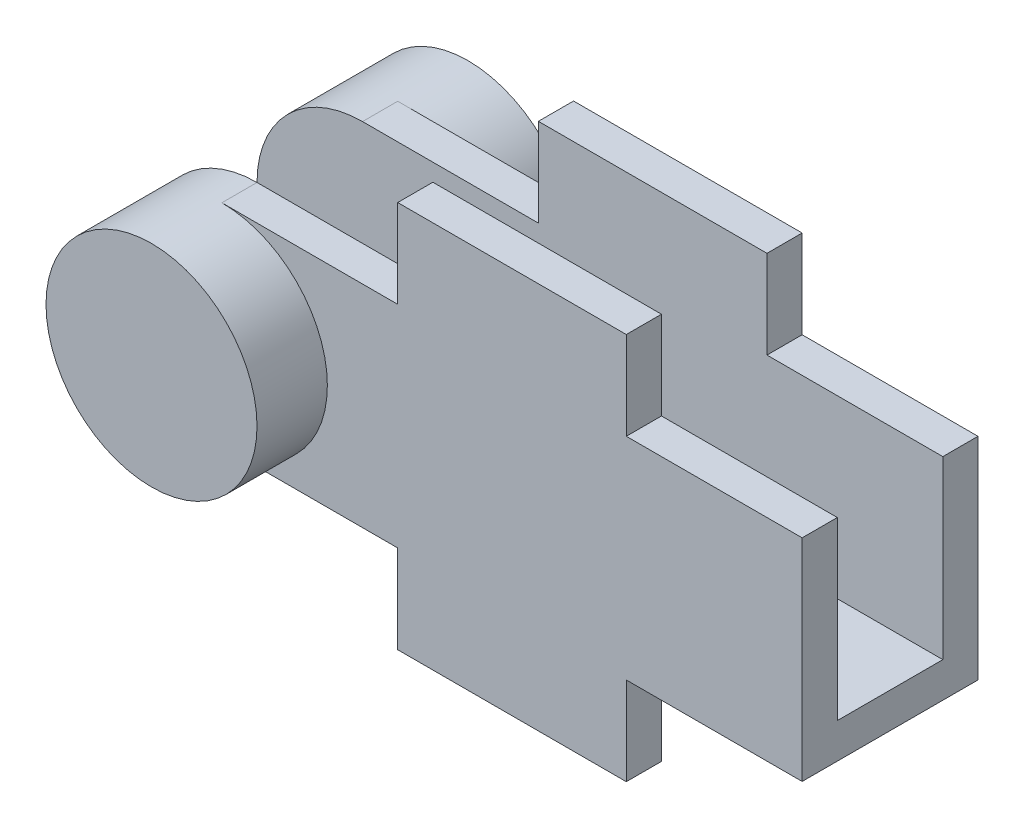
ISO-10303-21;
HEADER;
FILE_DESCRIPTION(('STEP AP214'),'2;1');
FILE_NAME('part.step','',(''),(''),'','','');
FILE_SCHEMA(('AUTOMOTIVE_DESIGN { 1 0 10303 214 1 1 1 1 }'));
ENDSEC;
DATA;
#1=APPLICATION_CONTEXT('core data for automotive mechanical design processes');
#2=APPLICATION_PROTOCOL_DEFINITION('international standard','automotive_design',2000,#1);
#3=PRODUCT_CONTEXT('',#1,'mechanical');
#4=PRODUCT('Part','Part','',(#3));
#5=PRODUCT_RELATED_PRODUCT_CATEGORY('part','',(#4));
#6=PRODUCT_DEFINITION_FORMATION('','',#4);
#7=PRODUCT_DEFINITION_CONTEXT('part definition',#1,'design');
#8=PRODUCT_DEFINITION('design','',#6,#7);
#9=PRODUCT_DEFINITION_SHAPE('','',#8);
#10=(LENGTH_UNIT() NAMED_UNIT(*) SI_UNIT(.MILLI.,.METRE.));
#11=(NAMED_UNIT(*) PLANE_ANGLE_UNIT() SI_UNIT($,.RADIAN.));
#12=(NAMED_UNIT(*) SI_UNIT($,.STERADIAN.) SOLID_ANGLE_UNIT());
#13=UNCERTAINTY_MEASURE_WITH_UNIT(LENGTH_MEASURE(1.E-05),#10,'distance_accuracy_value','');
#14=(GEOMETRIC_REPRESENTATION_CONTEXT(3) GLOBAL_UNCERTAINTY_ASSIGNED_CONTEXT((#13)) GLOBAL_UNIT_ASSIGNED_CONTEXT((#10,
#11,#12)) REPRESENTATION_CONTEXT('',''));
#15=CARTESIAN_POINT('',(0.,0.,0.));
#16=DIRECTION('',(0.,0.,1.));
#17=DIRECTION('',(1.,0.,0.));
#18=AXIS2_PLACEMENT_3D('',#15,#16,#17);
#19=CARTESIAN_POINT('',(-215.,-20.,10.));
#20=DIRECTION('',(-1.,0.,0.));
#21=DIRECTION('',(0.,-1.,0.));
#22=AXIS2_PLACEMENT_3D('',#19,#20,#21);
#23=PLANE('',#22);
#24=DIRECTION('',(0.,0.,-1.));
#25=VECTOR('',#24,1.);
#26=CARTESIAN_POINT('',(-215.,-20.,10.));
#27=LINE('',#26,#25);
#28=CARTESIAN_POINT('',(-215.,-20.,0.));
#29=VERTEX_POINT('',#28);
#30=CARTESIAN_POINT('',(-215.,-20.,-30.));
#31=VERTEX_POINT('',#30);
#32=EDGE_CURVE('E240',#29,#31,#27,.T.);
#33=ORIENTED_EDGE('',*,*,#32,.T.);
#34=DIRECTION('',(0.,-1.,0.));
#35=VECTOR('',#34,1.);
#36=CARTESIAN_POINT('',(-215.,-20.,-30.));
#37=LINE('',#36,#35);
#38=CARTESIAN_POINT('',(-215.,-30.,-30.));
#39=VERTEX_POINT('',#38);
#40=EDGE_CURVE('E71',#31,#39,#37,.T.);
#41=ORIENTED_EDGE('',*,*,#40,.T.);
#42=DIRECTION('',(0.,0.,-1.));
#43=VECTOR('',#42,1.);
#44=CARTESIAN_POINT('',(-215.,-30.,10.));
#45=LINE('',#44,#43);
#46=CARTESIAN_POINT('',(-215.,-30.,0.));
#47=VERTEX_POINT('',#46);
#48=EDGE_CURVE('E230',#47,#39,#45,.T.);
#49=ORIENTED_EDGE('',*,*,#48,.F.);
#50=DIRECTION('',(0.,-1.,0.));
#51=VECTOR('',#50,1.);
#52=CARTESIAN_POINT('',(-215.,0.,0.));
#53=LINE('',#52,#51);
#54=EDGE_CURVE('E385',#29,#47,#53,.T.);
#55=ORIENTED_EDGE('',*,*,#54,.F.);
#56=EDGE_LOOP('',(#33,#41,#49,#55));
#57=FACE_BOUND('',#56,.T.);
#58=ADVANCED_FACE('F46',(#57),#23,.T.);
#59=CARTESIAN_POINT('',(0.,-20.,0.));
#60=DIRECTION('',(0.,-1.,0.));
#61=DIRECTION('',(1.,0.,0.));
#62=AXIS2_PLACEMENT_3D('',#59,#60,#61);
#63=PLANE('',#62);
#64=DIRECTION('',(1.,0.,0.));
#65=VECTOR('',#64,1.);
#66=CARTESIAN_POINT('',(0.,-20.,-30.));
#67=LINE('',#66,#65);
#68=CARTESIAN_POINT('',(-50.,-20.,-30.));
#69=VERTEX_POINT('',#68);
#70=EDGE_CURVE('E50',#31,#69,#67,.T.);
#71=ORIENTED_EDGE('',*,*,#70,.F.);
#72=ORIENTED_EDGE('',*,*,#32,.F.);
#73=DIRECTION('',(1.,0.,0.));
#74=VECTOR('',#73,1.);
#75=CARTESIAN_POINT('',(0.,-20.,0.));
#76=LINE('',#75,#74);
#77=CARTESIAN_POINT('',(-50.,-20.,0.));
#78=VERTEX_POINT('',#77);
#79=EDGE_CURVE('E382',#29,#78,#76,.T.);
#80=ORIENTED_EDGE('',*,*,#79,.T.);
#81=DIRECTION('',(0.,0.,1.));
#82=VECTOR('',#81,1.);
#83=CARTESIAN_POINT('',(-50.,-20.,10.));
#84=LINE('',#83,#82);
#85=EDGE_CURVE('E245',#69,#78,#84,.T.);
#86=ORIENTED_EDGE('',*,*,#85,.F.);
#87=EDGE_LOOP('',(#71,#72,#80,#86));
#88=FACE_BOUND('',#87,.T.);
#89=ADVANCED_FACE('F534',(#88),#63,.F.);
#90=CARTESIAN_POINT('',(0.,0.,0.));
#91=DIRECTION('',(0.,0.,1.));
#92=DIRECTION('',(1.,0.,0.));
#93=AXIS2_PLACEMENT_3D('',#90,#91,#92);
#94=PLANE('',#93);
#95=ORIENTED_EDGE('',*,*,#79,.F.);
#96=ORIENTED_EDGE('',*,*,#54,.T.);
#97=CARTESIAN_POINT('',(-215.,0.,0.));
#98=DIRECTION('',(0.,0.,1.));
#99=DIRECTION('',(1.,0.,0.));
#100=AXIS2_PLACEMENT_3D('',#97,#98,#99);
#101=CIRCLE('',#100,30.);
#102=CARTESIAN_POINT('',(-215.,30.,0.));
#103=VERTEX_POINT('',#102);
#104=EDGE_CURVE('E309',#103,#47,#101,.T.);
#105=ORIENTED_EDGE('',*,*,#104,.F.);
#106=DIRECTION('',(1.,0.,0.));
#107=VECTOR('',#106,1.);
#108=CARTESIAN_POINT('',(0.,30.,0.));
#109=LINE('',#108,#107);
#110=CARTESIAN_POINT('',(-165.,30.,0.));
#111=VERTEX_POINT('',#110);
#112=EDGE_CURVE('E259',#103,#111,#109,.T.);
#113=ORIENTED_EDGE('',*,*,#112,.T.);
#114=DIRECTION('',(0.,1.,0.));
#115=VECTOR('',#114,1.);
#116=CARTESIAN_POINT('',(-165.,0.,0.));
#117=LINE('',#116,#115);
#118=CARTESIAN_POINT('',(-165.,55.0609756097561,0.));
#119=VERTEX_POINT('',#118);
#120=EDGE_CURVE('E270',#111,#119,#117,.T.);
#121=ORIENTED_EDGE('',*,*,#120,.T.);
#122=DIRECTION('',(1.,0.,0.));
#123=VECTOR('',#122,1.);
#124=CARTESIAN_POINT('',(0.,55.0609756097561,0.));
#125=LINE('',#124,#123);
#126=CARTESIAN_POINT('',(-100.,55.0609756097561,0.));
#127=VERTEX_POINT('',#126);
#128=EDGE_CURVE('E335',#119,#127,#125,.T.);
#129=ORIENTED_EDGE('',*,*,#128,.T.);
#130=DIRECTION('',(0.,-1.,0.));
#131=VECTOR('',#130,1.);
#132=CARTESIAN_POINT('',(-100.,0.,0.));
#133=LINE('',#132,#131);
#134=CARTESIAN_POINT('',(-100.,30.,0.));
#135=VERTEX_POINT('',#134);
#136=EDGE_CURVE('E331',#127,#135,#133,.T.);
#137=ORIENTED_EDGE('',*,*,#136,.T.);
#138=DIRECTION('',(1.,0.,0.));
#139=VECTOR('',#138,1.);
#140=CARTESIAN_POINT('',(0.,30.,0.));
#141=LINE('',#140,#139);
#142=CARTESIAN_POINT('',(-50.,30.,0.));
#143=VERTEX_POINT('',#142);
#144=EDGE_CURVE('E327',#135,#143,#141,.T.);
#145=ORIENTED_EDGE('',*,*,#144,.T.);
#146=DIRECTION('',(0.,-1.,0.));
#147=VECTOR('',#146,1.);
#148=CARTESIAN_POINT('',(-50.,0.,0.));
#149=LINE('',#148,#147);
#150=EDGE_CURVE('E323',#143,#78,#149,.T.);
#151=ORIENTED_EDGE('',*,*,#150,.T.);
#152=EDGE_LOOP('',(#95,#96,#105,#113,#121,#129,#137,#145,#151));
#153=FACE_BOUND('',#152,.T.);
#154=ADVANCED_FACE('F517',(#153),#94,.F.);
#155=CARTESIAN_POINT('',(0.,30.,10.));
#156=DIRECTION('',(0.,1.,0.));
#157=DIRECTION('',(0.,0.,1.));
#158=AXIS2_PLACEMENT_3D('',#155,#156,#157);
#159=PLANE('',#158);
#160=ORIENTED_EDGE('',*,*,#112,.F.);
#161=DIRECTION('',(0.,0.,-1.));
#162=VECTOR('',#161,1.);
#163=CARTESIAN_POINT('',(-215.,30.,10.));
#164=LINE('',#163,#162);
#165=CARTESIAN_POINT('',(-215.,30.,10.));
#166=VERTEX_POINT('',#165);
#167=EDGE_CURVE('E264',#166,#103,#164,.T.);
#168=ORIENTED_EDGE('',*,*,#167,.F.);
#169=DIRECTION('',(1.,0.,0.));
#170=VECTOR('',#169,1.);
#171=CARTESIAN_POINT('',(0.,30.,10.));
#172=LINE('',#171,#170);
#173=CARTESIAN_POINT('',(-165.,30.,10.));
#174=VERTEX_POINT('',#173);
#175=EDGE_CURVE('E265',#166,#174,#172,.T.);
#176=ORIENTED_EDGE('',*,*,#175,.T.);
#177=DIRECTION('',(0.,0.,-1.));
#178=VECTOR('',#177,1.);
#179=CARTESIAN_POINT('',(-165.,30.,10.));
#180=LINE('',#179,#178);
#181=EDGE_CURVE('E305',#174,#111,#180,.T.);
#182=ORIENTED_EDGE('',*,*,#181,.T.);
#183=EDGE_LOOP('',(#160,#168,#176,#182));
#184=FACE_BOUND('',#183,.T.);
#185=ADVANCED_FACE('F48',(#184),#159,.T.);
#186=CARTESIAN_POINT('',(-215.,0.,10.));
#187=DIRECTION('',(0.,0.,-1.));
#188=DIRECTION('',(-1.,0.,0.));
#189=AXIS2_PLACEMENT_3D('',#186,#187,#188);
#190=CYLINDRICAL_SURFACE('',#189,30.);
#191=ORIENTED_EDGE('',*,*,#104,.T.);
#192=DIRECTION('',(0.,0.,-1.));
#193=VECTOR('',#192,1.);
#194=CARTESIAN_POINT('',(-215.,-30.,10.));
#195=LINE('',#194,#193);
#196=CARTESIAN_POINT('',(-215.,-30.,10.));
#197=VERTEX_POINT('',#196);
#198=EDGE_CURVE('E375',#197,#47,#195,.T.);
#199=ORIENTED_EDGE('',*,*,#198,.F.);
#200=CARTESIAN_POINT('',(-215.,0.,10.));
#201=DIRECTION('',(0.,0.,1.));
#202=DIRECTION('',(1.,0.,0.));
#203=AXIS2_PLACEMENT_3D('',#200,#201,#202);
#204=CIRCLE('',#203,30.);
#205=EDGE_CURVE('E260',#197,#166,#204,.T.);
#206=ORIENTED_EDGE('',*,*,#205,.T.);
#207=ORIENTED_EDGE('',*,*,#167,.T.);
#208=EDGE_LOOP('',(#191,#199,#206,#207));
#209=FACE_BOUND('',#208,.T.);
#210=CARTESIAN_POINT('',(-215.,0.,30.));
#211=DIRECTION('',(0.,0.,1.));
#212=DIRECTION('',(1.,0.,0.));
#213=AXIS2_PLACEMENT_3D('',#210,#211,#212);
#214=CIRCLE('',#213,30.);
#215=CARTESIAN_POINT('',(-185.,0.,30.));
#216=VERTEX_POINT('',#215);
#217=EDGE_CURVE('E255',#216,#216,#214,.T.);
#218=ORIENTED_EDGE('',*,*,#217,.F.);
#219=EDGE_LOOP('',(#218));
#220=FACE_BOUND('',#219,.T.);
#221=ADVANCED_FACE('F513',(#209,#220),#190,.T.);
#222=CARTESIAN_POINT('',(-165.,0.,10.));
#223=DIRECTION('',(1.,0.,0.));
#224=DIRECTION('',(0.,0.,-1.));
#225=AXIS2_PLACEMENT_3D('',#222,#223,#224);
#226=PLANE('',#225);
#227=DIRECTION('',(0.,-1.,0.));
#228=VECTOR('',#227,1.);
#229=CARTESIAN_POINT('',(-165.,0.,0.));
#230=LINE('',#229,#228);
#231=CARTESIAN_POINT('',(-165.,-30.,0.));
#232=VERTEX_POINT('',#231);
#233=CARTESIAN_POINT('',(-165.,-55.0609756097561,0.));
#234=VERTEX_POINT('',#233);
#235=EDGE_CURVE('E313',#232,#234,#230,.T.);
#236=ORIENTED_EDGE('',*,*,#235,.T.);
#237=DIRECTION('',(0.,0.,-1.));
#238=VECTOR('',#237,1.);
#239=CARTESIAN_POINT('',(-165.,-55.0609756097561,10.));
#240=LINE('',#239,#238);
#241=CARTESIAN_POINT('',(-165.,-55.0609756097561,10.));
#242=VERTEX_POINT('',#241);
#243=EDGE_CURVE('E367',#242,#234,#240,.T.);
#244=ORIENTED_EDGE('',*,*,#243,.F.);
#245=DIRECTION('',(0.,-1.,0.));
#246=VECTOR('',#245,1.);
#247=CARTESIAN_POINT('',(-165.,0.,10.));
#248=LINE('',#247,#246);
#249=CARTESIAN_POINT('',(-165.,-30.,10.));
#250=VERTEX_POINT('',#249);
#251=EDGE_CURVE('E273',#250,#242,#248,.T.);
#252=ORIENTED_EDGE('',*,*,#251,.F.);
#253=DIRECTION('',(0.,0.,-1.));
#254=VECTOR('',#253,1.);
#255=CARTESIAN_POINT('',(-165.,-30.,10.));
#256=LINE('',#255,#254);
#257=EDGE_CURVE('E371',#250,#232,#256,.T.);
#258=ORIENTED_EDGE('',*,*,#257,.T.);
#259=EDGE_LOOP('',(#236,#244,#252,#258));
#260=FACE_BOUND('',#259,.T.);
#261=ADVANCED_FACE('F508',(#260),#226,.F.);
#262=CARTESIAN_POINT('',(0.,-55.0609756097561,10.));
#263=DIRECTION('',(0.,1.,0.));
#264=DIRECTION('',(0.,0.,1.));
#265=AXIS2_PLACEMENT_3D('',#262,#263,#264);
#266=PLANE('',#265);
#267=DIRECTION('',(1.,0.,0.));
#268=VECTOR('',#267,1.);
#269=CARTESIAN_POINT('',(0.,-55.0609756097561,0.));
#270=LINE('',#269,#268);
#271=CARTESIAN_POINT('',(-100.,-55.0609756097561,0.));
#272=VERTEX_POINT('',#271);
#273=EDGE_CURVE('E316',#234,#272,#270,.T.);
#274=ORIENTED_EDGE('',*,*,#273,.T.);
#275=DIRECTION('',(0.,0.,-1.));
#276=VECTOR('',#275,1.);
#277=CARTESIAN_POINT('',(-100.,-55.0609756097561,10.));
#278=LINE('',#277,#276);
#279=CARTESIAN_POINT('',(-100.,-55.0609756097561,10.));
#280=VERTEX_POINT('',#279);
#281=EDGE_CURVE('E363',#280,#272,#278,.T.);
#282=ORIENTED_EDGE('',*,*,#281,.F.);
#283=DIRECTION('',(1.,0.,0.));
#284=VECTOR('',#283,1.);
#285=CARTESIAN_POINT('',(0.,-55.0609756097561,10.));
#286=LINE('',#285,#284);
#287=EDGE_CURVE('E276',#242,#280,#286,.T.);
#288=ORIENTED_EDGE('',*,*,#287,.F.);
#289=ORIENTED_EDGE('',*,*,#243,.T.);
#290=EDGE_LOOP('',(#274,#282,#288,#289));
#291=FACE_BOUND('',#290,.T.);
#292=ADVANCED_FACE('F565',(#291),#266,.F.);
#293=CARTESIAN_POINT('',(-100.,0.,10.));
#294=DIRECTION('',(-1.,0.,0.));
#295=DIRECTION('',(0.,0.,1.));
#296=AXIS2_PLACEMENT_3D('',#293,#294,#295);
#297=PLANE('',#296);
#298=DIRECTION('',(0.,1.,0.));
#299=VECTOR('',#298,1.);
#300=CARTESIAN_POINT('',(-100.,0.,0.));
#301=LINE('',#300,#299);
#302=CARTESIAN_POINT('',(-100.,-30.,0.));
#303=VERTEX_POINT('',#302);
#304=EDGE_CURVE('E319',#272,#303,#301,.T.);
#305=ORIENTED_EDGE('',*,*,#304,.T.);
#306=DIRECTION('',(0.,0.,-1.));
#307=VECTOR('',#306,1.);
#308=CARTESIAN_POINT('',(-100.,-30.,10.));
#309=LINE('',#308,#307);
#310=CARTESIAN_POINT('',(-100.,-30.,10.));
#311=VERTEX_POINT('',#310);
#312=EDGE_CURVE('E359',#311,#303,#309,.T.);
#313=ORIENTED_EDGE('',*,*,#312,.F.);
#314=DIRECTION('',(0.,1.,0.));
#315=VECTOR('',#314,1.);
#316=CARTESIAN_POINT('',(-100.,0.,10.));
#317=LINE('',#316,#315);
#318=EDGE_CURVE('E279',#280,#311,#317,.T.);
#319=ORIENTED_EDGE('',*,*,#318,.F.);
#320=ORIENTED_EDGE('',*,*,#281,.T.);
#321=EDGE_LOOP('',(#305,#313,#319,#320));
#322=FACE_BOUND('',#321,.T.);
#323=ADVANCED_FACE('F498',(#322),#297,.F.);
#324=CARTESIAN_POINT('',(0.,-30.,10.));
#325=DIRECTION('',(0.,1.,0.));
#326=DIRECTION('',(0.,0.,1.));
#327=AXIS2_PLACEMENT_3D('',#324,#325,#326);
#328=PLANE('',#327);
#329=DIRECTION('',(1.,0.,0.));
#330=VECTOR('',#329,1.);
#331=CARTESIAN_POINT('',(-215.,-30.,-40.));
#332=LINE('',#331,#330);
#333=CARTESIAN_POINT('',(-215.,-30.,-40.));
#334=VERTEX_POINT('',#333);
#335=CARTESIAN_POINT('',(-165.,-30.,-40.));
#336=VERTEX_POINT('',#335);
#337=EDGE_CURVE('E227',#334,#336,#332,.T.);
#338=ORIENTED_EDGE('',*,*,#337,.T.);
#339=DIRECTION('',(0.,0.,1.));
#340=VECTOR('',#339,1.);
#341=CARTESIAN_POINT('',(-165.,-30.,-40.));
#342=LINE('',#341,#340);
#343=CARTESIAN_POINT('',(-165.,-30.,-30.));
#344=VERTEX_POINT('',#343);
#345=EDGE_CURVE('E232',#336,#344,#342,.T.);
#346=ORIENTED_EDGE('',*,*,#345,.T.);
#347=DIRECTION('',(-1.,0.,0.));
#348=VECTOR('',#347,1.);
#349=CARTESIAN_POINT('',(0.,-30.,-30.));
#350=LINE('',#349,#348);
#351=CARTESIAN_POINT('',(-100.,-30.,-30.));
#352=VERTEX_POINT('',#351);
#353=EDGE_CURVE('E63',#352,#344,#350,.T.);
#354=ORIENTED_EDGE('',*,*,#353,.F.);
#355=DIRECTION('',(0.,0.,1.));
#356=VECTOR('',#355,1.);
#357=CARTESIAN_POINT('',(-100.,-30.,-40.));
#358=LINE('',#357,#356);
#359=CARTESIAN_POINT('',(-100.,-30.,-40.));
#360=VERTEX_POINT('',#359);
#361=EDGE_CURVE('E441',#360,#352,#358,.T.);
#362=ORIENTED_EDGE('',*,*,#361,.F.);
#363=CARTESIAN_POINT('',(-50.,-30.,-40.));
#364=VERTEX_POINT('',#363);
#365=EDGE_CURVE('E241',#360,#364,#332,.T.);
#366=ORIENTED_EDGE('',*,*,#365,.T.);
#367=DIRECTION('',(0.,0.,-1.));
#368=VECTOR('',#367,1.);
#369=CARTESIAN_POINT('',(-50.,-30.,10.));
#370=LINE('',#369,#368);
#371=CARTESIAN_POINT('',(-50.,-30.,10.));
#372=VERTEX_POINT('',#371);
#373=EDGE_CURVE('E356',#372,#364,#370,.T.);
#374=ORIENTED_EDGE('',*,*,#373,.F.);
#375=DIRECTION('',(1.,0.,0.));
#376=VECTOR('',#375,1.);
#377=CARTESIAN_POINT('',(0.,-30.,10.));
#378=LINE('',#377,#376);
#379=EDGE_CURVE('E282',#311,#372,#378,.T.);
#380=ORIENTED_EDGE('',*,*,#379,.F.);
#381=ORIENTED_EDGE('',*,*,#312,.T.);
#382=DIRECTION('',(1.,0.,0.));
#383=VECTOR('',#382,1.);
#384=CARTESIAN_POINT('',(0.,-30.,0.));
#385=LINE('',#384,#383);
#386=EDGE_CURVE('E263',#232,#303,#385,.T.);
#387=ORIENTED_EDGE('',*,*,#386,.F.);
#388=ORIENTED_EDGE('',*,*,#257,.F.);
#389=DIRECTION('',(1.,0.,0.));
#390=VECTOR('',#389,1.);
#391=CARTESIAN_POINT('',(0.,-30.,10.));
#392=LINE('',#391,#390);
#393=EDGE_CURVE('E269',#197,#250,#392,.T.);
#394=ORIENTED_EDGE('',*,*,#393,.F.);
#395=ORIENTED_EDGE('',*,*,#198,.T.);
#396=ORIENTED_EDGE('',*,*,#48,.T.);
#397=DIRECTION('',(0.,0.,1.));
#398=VECTOR('',#397,1.);
#399=CARTESIAN_POINT('',(-215.,-30.,-40.));
#400=LINE('',#399,#398);
#401=EDGE_CURVE('E219',#334,#39,#400,.T.);
#402=ORIENTED_EDGE('',*,*,#401,.F.);
#403=EDGE_LOOP('',(#338,#346,#354,#362,#366,#374,#380,#381,#387,#388,#394,#395,#396,#402));
#404=FACE_BOUND('',#403,.T.);
#405=ADVANCED_FACE('F226',(#404),#328,.F.);
#406=CARTESIAN_POINT('',(-50.,0.,10.));
#407=DIRECTION('',(1.,0.,0.));
#408=DIRECTION('',(0.,1.,0.));
#409=AXIS2_PLACEMENT_3D('',#406,#407,#408);
#410=PLANE('',#409);
#411=DIRECTION('',(0.,-1.,0.));
#412=VECTOR('',#411,1.);
#413=CARTESIAN_POINT('',(-50.,0.,-30.));
#414=LINE('',#413,#412);
#415=CARTESIAN_POINT('',(-50.,30.,-30.));
#416=VERTEX_POINT('',#415);
#417=EDGE_CURVE('E398',#416,#69,#414,.T.);
#418=ORIENTED_EDGE('',*,*,#417,.T.);
#419=ORIENTED_EDGE('',*,*,#85,.T.);
#420=ORIENTED_EDGE('',*,*,#150,.F.);
#421=DIRECTION('',(0.,0.,-1.));
#422=VECTOR('',#421,1.);
#423=CARTESIAN_POINT('',(-50.,30.,10.));
#424=LINE('',#423,#422);
#425=CARTESIAN_POINT('',(-50.,30.,10.));
#426=VERTEX_POINT('',#425);
#427=EDGE_CURVE('E353',#426,#143,#424,.T.);
#428=ORIENTED_EDGE('',*,*,#427,.F.);
#429=DIRECTION('',(0.,-1.,0.));
#430=VECTOR('',#429,1.);
#431=CARTESIAN_POINT('',(-50.,0.,10.));
#432=LINE('',#431,#430);
#433=EDGE_CURVE('E286',#426,#372,#432,.T.);
#434=ORIENTED_EDGE('',*,*,#433,.T.);
#435=ORIENTED_EDGE('',*,*,#373,.T.);
#436=DIRECTION('',(0.,-1.,0.));
#437=VECTOR('',#436,1.);
#438=CARTESIAN_POINT('',(-50.,-20.,-40.));
#439=LINE('',#438,#437);
#440=CARTESIAN_POINT('',(-50.,30.,-40.));
#441=VERTEX_POINT('',#440);
#442=EDGE_CURVE('E251',#441,#364,#439,.T.);
#443=ORIENTED_EDGE('',*,*,#442,.F.);
#444=DIRECTION('',(0.,0.,1.));
#445=VECTOR('',#444,1.);
#446=CARTESIAN_POINT('',(-50.,30.,-40.));
#447=LINE('',#446,#445);
#448=EDGE_CURVE('E406',#441,#416,#447,.T.);
#449=ORIENTED_EDGE('',*,*,#448,.T.);
#450=EDGE_LOOP('',(#418,#419,#420,#428,#434,#435,#443,#449));
#451=FACE_BOUND('',#450,.T.);
#452=ADVANCED_FACE('F403',(#451),#410,.T.);
#453=CARTESIAN_POINT('',(0.,30.,10.));
#454=DIRECTION('',(0.,1.,0.));
#455=DIRECTION('',(0.,0.,1.));
#456=AXIS2_PLACEMENT_3D('',#453,#454,#455);
#457=PLANE('',#456);
#458=ORIENTED_EDGE('',*,*,#144,.F.);
#459=DIRECTION('',(0.,0.,-1.));
#460=VECTOR('',#459,1.);
#461=CARTESIAN_POINT('',(-100.,30.,10.));
#462=LINE('',#461,#460);
#463=CARTESIAN_POINT('',(-100.,30.,10.));
#464=VERTEX_POINT('',#463);
#465=EDGE_CURVE('E350',#464,#135,#462,.T.);
#466=ORIENTED_EDGE('',*,*,#465,.F.);
#467=DIRECTION('',(1.,0.,0.));
#468=VECTOR('',#467,1.);
#469=CARTESIAN_POINT('',(0.,30.,10.));
#470=LINE('',#469,#468);
#471=EDGE_CURVE('E289',#464,#426,#470,.T.);
#472=ORIENTED_EDGE('',*,*,#471,.T.);
#473=ORIENTED_EDGE('',*,*,#427,.T.);
#474=EDGE_LOOP('',(#458,#466,#472,#473));
#475=FACE_BOUND('',#474,.T.);
#476=ADVANCED_FACE('F533',(#475),#457,.T.);
#477=CARTESIAN_POINT('',(-100.,0.,10.));
#478=DIRECTION('',(1.,0.,0.));
#479=DIRECTION('',(0.,0.,-1.));
#480=AXIS2_PLACEMENT_3D('',#477,#478,#479);
#481=PLANE('',#480);
#482=ORIENTED_EDGE('',*,*,#136,.F.);
#483=DIRECTION('',(0.,0.,-1.));
#484=VECTOR('',#483,1.);
#485=CARTESIAN_POINT('',(-100.,55.0609756097561,10.));
#486=LINE('',#485,#484);
#487=CARTESIAN_POINT('',(-100.,55.0609756097561,10.));
#488=VERTEX_POINT('',#487);
#489=EDGE_CURVE('E347',#488,#127,#486,.T.);
#490=ORIENTED_EDGE('',*,*,#489,.F.);
#491=DIRECTION('',(0.,-1.,0.));
#492=VECTOR('',#491,1.);
#493=CARTESIAN_POINT('',(-100.,0.,10.));
#494=LINE('',#493,#492);
#495=EDGE_CURVE('E293',#488,#464,#494,.T.);
#496=ORIENTED_EDGE('',*,*,#495,.T.);
#497=ORIENTED_EDGE('',*,*,#465,.T.);
#498=EDGE_LOOP('',(#482,#490,#496,#497));
#499=FACE_BOUND('',#498,.T.);
#500=ADVANCED_FACE('F530',(#499),#481,.T.);
#501=CARTESIAN_POINT('',(0.,55.0609756097561,10.));
#502=DIRECTION('',(0.,1.,0.));
#503=DIRECTION('',(0.,0.,1.));
#504=AXIS2_PLACEMENT_3D('',#501,#502,#503);
#505=PLANE('',#504);
#506=ORIENTED_EDGE('',*,*,#128,.F.);
#507=DIRECTION('',(0.,0.,-1.));
#508=VECTOR('',#507,1.);
#509=CARTESIAN_POINT('',(-165.,55.0609756097561,10.));
#510=LINE('',#509,#508);
#511=CARTESIAN_POINT('',(-165.,55.0609756097561,10.));
#512=VERTEX_POINT('',#511);
#513=EDGE_CURVE('E344',#512,#119,#510,.T.);
#514=ORIENTED_EDGE('',*,*,#513,.F.);
#515=DIRECTION('',(1.,0.,0.));
#516=VECTOR('',#515,1.);
#517=CARTESIAN_POINT('',(0.,55.0609756097561,10.));
#518=LINE('',#517,#516);
#519=EDGE_CURVE('E297',#512,#488,#518,.T.);
#520=ORIENTED_EDGE('',*,*,#519,.T.);
#521=ORIENTED_EDGE('',*,*,#489,.T.);
#522=EDGE_LOOP('',(#506,#514,#520,#521));
#523=FACE_BOUND('',#522,.T.);
#524=ADVANCED_FACE('F526',(#523),#505,.T.);
#525=CARTESIAN_POINT('',(-165.,0.,10.));
#526=DIRECTION('',(-1.,0.,0.));
#527=DIRECTION('',(0.,0.,1.));
#528=AXIS2_PLACEMENT_3D('',#525,#526,#527);
#529=PLANE('',#528);
#530=ORIENTED_EDGE('',*,*,#120,.F.);
#531=ORIENTED_EDGE('',*,*,#181,.F.);
#532=DIRECTION('',(0.,1.,0.));
#533=VECTOR('',#532,1.);
#534=CARTESIAN_POINT('',(-165.,0.,10.));
#535=LINE('',#534,#533);
#536=EDGE_CURVE('E301',#174,#512,#535,.T.);
#537=ORIENTED_EDGE('',*,*,#536,.T.);
#538=ORIENTED_EDGE('',*,*,#513,.T.);
#539=EDGE_LOOP('',(#530,#531,#537,#538));
#540=FACE_BOUND('',#539,.T.);
#541=ADVANCED_FACE('F522',(#540),#529,.T.);
#542=CARTESIAN_POINT('',(0.,0.,10.));
#543=DIRECTION('',(0.,0.,1.));
#544=DIRECTION('',(1.,0.,0.));
#545=AXIS2_PLACEMENT_3D('',#542,#543,#544);
#546=PLANE('',#545);
#547=ORIENTED_EDGE('',*,*,#318,.T.);
#548=ORIENTED_EDGE('',*,*,#379,.T.);
#549=ORIENTED_EDGE('',*,*,#433,.F.);
#550=ORIENTED_EDGE('',*,*,#471,.F.);
#551=ORIENTED_EDGE('',*,*,#495,.F.);
#552=ORIENTED_EDGE('',*,*,#519,.F.);
#553=ORIENTED_EDGE('',*,*,#536,.F.);
#554=ORIENTED_EDGE('',*,*,#175,.F.);
#555=ORIENTED_EDGE('',*,*,#205,.F.);
#556=ORIENTED_EDGE('',*,*,#393,.T.);
#557=ORIENTED_EDGE('',*,*,#251,.T.);
#558=ORIENTED_EDGE('',*,*,#287,.T.);
#559=EDGE_LOOP('',(#547,#548,#549,#550,#551,#552,#553,#554,#555,#556,#557,#558));
#560=FACE_BOUND('',#559,.T.);
#561=ADVANCED_FACE('F492',(#560),#546,.T.);
#562=ORIENTED_EDGE('',*,*,#235,.F.);
#563=ORIENTED_EDGE('',*,*,#386,.T.);
#564=ORIENTED_EDGE('',*,*,#304,.F.);
#565=ORIENTED_EDGE('',*,*,#273,.F.);
#566=EDGE_LOOP('',(#562,#563,#564,#565));
#567=FACE_BOUND('',#566,.T.);
#568=ADVANCED_FACE('F503',(#567),#94,.F.);
#569=CARTESIAN_POINT('',(-215.,0.,30.));
#570=DIRECTION('',(0.,0.,1.));
#571=DIRECTION('',(1.,0.,0.));
#572=AXIS2_PLACEMENT_3D('',#569,#570,#571);
#573=PLANE('',#572);
#574=ORIENTED_EDGE('',*,*,#217,.T.);
#575=EDGE_LOOP('',(#574));
#576=FACE_BOUND('',#575,.T.);
#577=ADVANCED_FACE('F543',(#576),#573,.T.);
#578=CARTESIAN_POINT('',(-215.,-20.,-40.));
#579=DIRECTION('',(0.,0.,-1.));
#580=DIRECTION('',(-1.,0.,0.));
#581=AXIS2_PLACEMENT_3D('',#578,#579,#580);
#582=PLANE('',#581);
#583=ORIENTED_EDGE('',*,*,#337,.F.);
#584=CARTESIAN_POINT('',(-215.,0.,-40.));
#585=DIRECTION('',(0.,0.,1.));
#586=DIRECTION('',(1.,0.,0.));
#587=AXIS2_PLACEMENT_3D('',#584,#585,#586);
#588=CIRCLE('',#587,30.);
#589=CARTESIAN_POINT('',(-215.,30.,-40.));
#590=VERTEX_POINT('',#589);
#591=EDGE_CURVE('E11',#334,#590,#588,.T.);
#592=ORIENTED_EDGE('',*,*,#591,.T.);
#593=DIRECTION('',(1.,0.,0.));
#594=VECTOR('',#593,1.);
#595=CARTESIAN_POINT('',(0.,30.,-40.));
#596=LINE('',#595,#594);
#597=CARTESIAN_POINT('',(-165.,30.,-40.));
#598=VERTEX_POINT('',#597);
#599=EDGE_CURVE('E430',#590,#598,#596,.T.);
#600=ORIENTED_EDGE('',*,*,#599,.T.);
#601=DIRECTION('',(0.,1.,0.));
#602=VECTOR('',#601,1.);
#603=CARTESIAN_POINT('',(-165.,0.,-40.));
#604=LINE('',#603,#602);
#605=CARTESIAN_POINT('',(-165.,55.0609756097561,-40.));
#606=VERTEX_POINT('',#605);
#607=EDGE_CURVE('E903',#598,#606,#604,.T.);
#608=ORIENTED_EDGE('',*,*,#607,.T.);
#609=DIRECTION('',(1.,0.,0.));
#610=VECTOR('',#609,1.);
#611=CARTESIAN_POINT('',(0.,55.0609756097561,-40.));
#612=LINE('',#611,#610);
#613=CARTESIAN_POINT('',(-100.,55.0609756097561,-40.));
#614=VERTEX_POINT('',#613);
#615=EDGE_CURVE('E906',#606,#614,#612,.T.);
#616=ORIENTED_EDGE('',*,*,#615,.T.);
#617=DIRECTION('',(0.,-1.,0.));
#618=VECTOR('',#617,1.);
#619=CARTESIAN_POINT('',(-100.,0.,-40.));
#620=LINE('',#619,#618);
#621=CARTESIAN_POINT('',(-100.,30.,-40.));
#622=VERTEX_POINT('',#621);
#623=EDGE_CURVE('E909',#614,#622,#620,.T.);
#624=ORIENTED_EDGE('',*,*,#623,.T.);
#625=DIRECTION('',(1.,0.,0.));
#626=VECTOR('',#625,1.);
#627=CARTESIAN_POINT('',(0.,30.,-40.));
#628=LINE('',#627,#626);
#629=EDGE_CURVE('E487',#622,#441,#628,.T.);
#630=ORIENTED_EDGE('',*,*,#629,.T.);
#631=ORIENTED_EDGE('',*,*,#442,.T.);
#632=ORIENTED_EDGE('',*,*,#365,.F.);
#633=DIRECTION('',(0.,1.,0.));
#634=VECTOR('',#633,1.);
#635=CARTESIAN_POINT('',(-100.,0.,-40.));
#636=LINE('',#635,#634);
#637=CARTESIAN_POINT('',(-100.,-55.0609756097561,-40.));
#638=VERTEX_POINT('',#637);
#639=EDGE_CURVE('E482',#638,#360,#636,.T.);
#640=ORIENTED_EDGE('',*,*,#639,.F.);
#641=DIRECTION('',(1.,0.,0.));
#642=VECTOR('',#641,1.);
#643=CARTESIAN_POINT('',(0.,-55.0609756097561,-40.));
#644=LINE('',#643,#642);
#645=CARTESIAN_POINT('',(-165.,-55.0609756097561,-40.));
#646=VERTEX_POINT('',#645);
#647=EDGE_CURVE('E477',#646,#638,#644,.T.);
#648=ORIENTED_EDGE('',*,*,#647,.F.);
#649=DIRECTION('',(0.,-1.,0.));
#650=VECTOR('',#649,1.);
#651=CARTESIAN_POINT('',(-165.,0.,-40.));
#652=LINE('',#651,#650);
#653=EDGE_CURVE('E238',#336,#646,#652,.T.);
#654=ORIENTED_EDGE('',*,*,#653,.F.);
#655=EDGE_LOOP('',(#583,#592,#600,#608,#616,#624,#630,#631,#632,#640,#648,#654));
#656=FACE_BOUND('',#655,.T.);
#657=ADVANCED_FACE('F235',(#656),#582,.T.);
#658=CARTESIAN_POINT('',(0.,30.,-40.));
#659=DIRECTION('',(0.,-1.,0.));
#660=DIRECTION('',(0.,0.,-1.));
#661=AXIS2_PLACEMENT_3D('',#658,#659,#660);
#662=PLANE('',#661);
#663=DIRECTION('',(1.,0.,0.));
#664=VECTOR('',#663,1.);
#665=CARTESIAN_POINT('',(0.,30.,-30.));
#666=LINE('',#665,#664);
#667=CARTESIAN_POINT('',(-215.,30.,-30.));
#668=VERTEX_POINT('',#667);
#669=CARTESIAN_POINT('',(-165.,30.,-30.));
#670=VERTEX_POINT('',#669);
#671=EDGE_CURVE('E894',#668,#670,#666,.T.);
#672=ORIENTED_EDGE('',*,*,#671,.T.);
#673=DIRECTION('',(0.,0.,1.));
#674=VECTOR('',#673,1.);
#675=CARTESIAN_POINT('',(-165.,30.,-40.));
#676=LINE('',#675,#674);
#677=EDGE_CURVE('E458',#598,#670,#676,.T.);
#678=ORIENTED_EDGE('',*,*,#677,.F.);
#679=ORIENTED_EDGE('',*,*,#599,.F.);
#680=DIRECTION('',(0.,0.,1.));
#681=VECTOR('',#680,1.);
#682=CARTESIAN_POINT('',(-215.,30.,-40.));
#683=LINE('',#682,#681);
#684=EDGE_CURVE('E221',#590,#668,#683,.T.);
#685=ORIENTED_EDGE('',*,*,#684,.T.);
#686=EDGE_LOOP('',(#672,#678,#679,#685));
#687=FACE_BOUND('',#686,.T.);
#688=ADVANCED_FACE('F612',(#687),#662,.F.);
#689=CARTESIAN_POINT('',(-165.,0.,-40.));
#690=DIRECTION('',(1.,0.,0.));
#691=DIRECTION('',(0.,0.,-1.));
#692=AXIS2_PLACEMENT_3D('',#689,#690,#691);
#693=PLANE('',#692);
#694=DIRECTION('',(0.,1.,0.));
#695=VECTOR('',#694,1.);
#696=CARTESIAN_POINT('',(-165.,0.,-30.));
#697=LINE('',#696,#695);
#698=CARTESIAN_POINT('',(-165.,55.0609756097561,-30.));
#699=VERTEX_POINT('',#698);
#700=EDGE_CURVE('E898',#670,#699,#697,.T.);
#701=ORIENTED_EDGE('',*,*,#700,.T.);
#702=DIRECTION('',(0.,0.,1.));
#703=VECTOR('',#702,1.);
#704=CARTESIAN_POINT('',(-165.,55.0609756097561,-40.));
#705=LINE('',#704,#703);
#706=EDGE_CURVE('E454',#606,#699,#705,.T.);
#707=ORIENTED_EDGE('',*,*,#706,.F.);
#708=ORIENTED_EDGE('',*,*,#607,.F.);
#709=ORIENTED_EDGE('',*,*,#677,.T.);
#710=EDGE_LOOP('',(#701,#707,#708,#709));
#711=FACE_BOUND('',#710,.T.);
#712=ADVANCED_FACE('F622',(#711),#693,.F.);
#713=CARTESIAN_POINT('',(0.,55.0609756097561,-40.));
#714=DIRECTION('',(0.,-1.,0.));
#715=DIRECTION('',(0.,0.,-1.));
#716=AXIS2_PLACEMENT_3D('',#713,#714,#715);
#717=PLANE('',#716);
#718=DIRECTION('',(1.,0.,0.));
#719=VECTOR('',#718,1.);
#720=CARTESIAN_POINT('',(0.,55.0609756097561,-30.));
#721=LINE('',#720,#719);
#722=CARTESIAN_POINT('',(-100.,55.0609756097561,-30.));
#723=VERTEX_POINT('',#722);
#724=EDGE_CURVE('E922',#699,#723,#721,.T.);
#725=ORIENTED_EDGE('',*,*,#724,.T.);
#726=DIRECTION('',(0.,0.,1.));
#727=VECTOR('',#726,1.);
#728=CARTESIAN_POINT('',(-100.,55.0609756097561,-40.));
#729=LINE('',#728,#727);
#730=EDGE_CURVE('E450',#614,#723,#729,.T.);
#731=ORIENTED_EDGE('',*,*,#730,.F.);
#732=ORIENTED_EDGE('',*,*,#615,.F.);
#733=ORIENTED_EDGE('',*,*,#706,.T.);
#734=EDGE_LOOP('',(#725,#731,#732,#733));
#735=FACE_BOUND('',#734,.T.);
#736=ADVANCED_FACE('F635',(#735),#717,.F.);
#737=CARTESIAN_POINT('',(-100.,0.,-40.));
#738=DIRECTION('',(-1.,0.,0.));
#739=DIRECTION('',(0.,0.,1.));
#740=AXIS2_PLACEMENT_3D('',#737,#738,#739);
#741=PLANE('',#740);
#742=DIRECTION('',(0.,-1.,0.));
#743=VECTOR('',#742,1.);
#744=CARTESIAN_POINT('',(-100.,0.,-30.));
#745=LINE('',#744,#743);
#746=CARTESIAN_POINT('',(-100.,30.,-30.));
#747=VERTEX_POINT('',#746);
#748=EDGE_CURVE('E416',#723,#747,#745,.T.);
#749=ORIENTED_EDGE('',*,*,#748,.T.);
#750=DIRECTION('',(0.,0.,1.));
#751=VECTOR('',#750,1.);
#752=CARTESIAN_POINT('',(-100.,30.,-40.));
#753=LINE('',#752,#751);
#754=EDGE_CURVE('E446',#622,#747,#753,.T.);
#755=ORIENTED_EDGE('',*,*,#754,.F.);
#756=ORIENTED_EDGE('',*,*,#623,.F.);
#757=ORIENTED_EDGE('',*,*,#730,.T.);
#758=EDGE_LOOP('',(#749,#755,#756,#757));
#759=FACE_BOUND('',#758,.T.);
#760=ADVANCED_FACE('F648',(#759),#741,.F.);
#761=CARTESIAN_POINT('',(0.,30.,-40.));
#762=DIRECTION('',(0.,-1.,0.));
#763=DIRECTION('',(0.,0.,-1.));
#764=AXIS2_PLACEMENT_3D('',#761,#762,#763);
#765=PLANE('',#764);
#766=DIRECTION('',(1.,0.,0.));
#767=VECTOR('',#766,1.);
#768=CARTESIAN_POINT('',(0.,30.,-30.));
#769=LINE('',#768,#767);
#770=EDGE_CURVE('E409',#747,#416,#769,.T.);
#771=ORIENTED_EDGE('',*,*,#770,.T.);
#772=ORIENTED_EDGE('',*,*,#448,.F.);
#773=ORIENTED_EDGE('',*,*,#629,.F.);
#774=ORIENTED_EDGE('',*,*,#754,.T.);
#775=EDGE_LOOP('',(#771,#772,#773,#774));
#776=FACE_BOUND('',#775,.T.);
#777=ADVANCED_FACE('F660',(#776),#765,.F.);
#778=CARTESIAN_POINT('',(0.,0.,-30.));
#779=DIRECTION('',(0.,0.,-1.));
#780=DIRECTION('',(1.,0.,0.));
#781=AXIS2_PLACEMENT_3D('',#778,#779,#780);
#782=PLANE('',#781);
#783=ORIENTED_EDGE('',*,*,#40,.F.);
#784=ORIENTED_EDGE('',*,*,#70,.T.);
#785=ORIENTED_EDGE('',*,*,#417,.F.);
#786=ORIENTED_EDGE('',*,*,#770,.F.);
#787=ORIENTED_EDGE('',*,*,#748,.F.);
#788=ORIENTED_EDGE('',*,*,#724,.F.);
#789=ORIENTED_EDGE('',*,*,#700,.F.);
#790=ORIENTED_EDGE('',*,*,#671,.F.);
#791=CARTESIAN_POINT('',(-215.,0.,-30.));
#792=DIRECTION('',(0.,0.,1.));
#793=DIRECTION('',(1.,0.,0.));
#794=AXIS2_PLACEMENT_3D('',#791,#792,#793);
#795=CIRCLE('',#794,30.);
#796=EDGE_CURVE('E427',#668,#39,#795,.T.);
#797=ORIENTED_EDGE('',*,*,#796,.T.);
#798=EDGE_LOOP('',(#783,#784,#785,#786,#787,#788,#789,#790,#797));
#799=FACE_BOUND('',#798,.T.);
#800=ADVANCED_FACE('F396',(#799),#782,.F.);
#801=CARTESIAN_POINT('',(-215.,0.,-40.));
#802=DIRECTION('',(0.,0.,1.));
#803=DIRECTION('',(1.,0.,0.));
#804=AXIS2_PLACEMENT_3D('',#801,#802,#803);
#805=CYLINDRICAL_SURFACE('',#804,30.);
#806=ORIENTED_EDGE('',*,*,#796,.F.);
#807=ORIENTED_EDGE('',*,*,#684,.F.);
#808=ORIENTED_EDGE('',*,*,#591,.F.);
#809=ORIENTED_EDGE('',*,*,#401,.T.);
#810=EDGE_LOOP('',(#806,#807,#808,#809));
#811=FACE_BOUND('',#810,.T.);
#812=CARTESIAN_POINT('',(-215.,0.,-60.));
#813=DIRECTION('',(0.,0.,1.));
#814=DIRECTION('',(1.,0.,0.));
#815=AXIS2_PLACEMENT_3D('',#812,#813,#814);
#816=CIRCLE('',#815,30.);
#817=CARTESIAN_POINT('',(-185.,0.,-60.));
#818=VERTEX_POINT('',#817);
#819=EDGE_CURVE('E892',#818,#818,#816,.T.);
#820=ORIENTED_EDGE('',*,*,#819,.T.);
#821=EDGE_LOOP('',(#820));
#822=FACE_BOUND('',#821,.T.);
#823=ADVANCED_FACE('F217',(#811,#822),#805,.T.);
#824=DIRECTION('',(0.,1.,0.));
#825=VECTOR('',#824,1.);
#826=CARTESIAN_POINT('',(-100.,0.,-30.));
#827=LINE('',#826,#825);
#828=CARTESIAN_POINT('',(-100.,-55.0609756097561,-30.));
#829=VERTEX_POINT('',#828);
#830=EDGE_CURVE('E408',#829,#352,#827,.T.);
#831=ORIENTED_EDGE('',*,*,#830,.T.);
#832=ORIENTED_EDGE('',*,*,#353,.T.);
#833=DIRECTION('',(0.,-1.,0.));
#834=VECTOR('',#833,1.);
#835=CARTESIAN_POINT('',(-165.,0.,-30.));
#836=LINE('',#835,#834);
#837=CARTESIAN_POINT('',(-165.,-55.0609756097561,-30.));
#838=VERTEX_POINT('',#837);
#839=EDGE_CURVE('E423',#344,#838,#836,.T.);
#840=ORIENTED_EDGE('',*,*,#839,.T.);
#841=DIRECTION('',(1.,0.,0.));
#842=VECTOR('',#841,1.);
#843=CARTESIAN_POINT('',(0.,-55.0609756097561,-30.));
#844=LINE('',#843,#842);
#845=EDGE_CURVE('E414',#838,#829,#844,.T.);
#846=ORIENTED_EDGE('',*,*,#845,.T.);
#847=EDGE_LOOP('',(#831,#832,#840,#846));
#848=FACE_BOUND('',#847,.T.);
#849=ADVANCED_FACE('F469',(#848),#782,.F.);
#850=CARTESIAN_POINT('',(-100.,0.,-40.));
#851=DIRECTION('',(1.,0.,0.));
#852=DIRECTION('',(0.,0.,-1.));
#853=AXIS2_PLACEMENT_3D('',#850,#851,#852);
#854=PLANE('',#853);
#855=ORIENTED_EDGE('',*,*,#830,.F.);
#856=DIRECTION('',(0.,0.,1.));
#857=VECTOR('',#856,1.);
#858=CARTESIAN_POINT('',(-100.,-55.0609756097561,-40.));
#859=LINE('',#858,#857);
#860=EDGE_CURVE('E438',#638,#829,#859,.T.);
#861=ORIENTED_EDGE('',*,*,#860,.F.);
#862=ORIENTED_EDGE('',*,*,#639,.T.);
#863=ORIENTED_EDGE('',*,*,#361,.T.);
#864=EDGE_LOOP('',(#855,#861,#862,#863));
#865=FACE_BOUND('',#864,.T.);
#866=ADVANCED_FACE('F481',(#865),#854,.T.);
#867=CARTESIAN_POINT('',(0.,-55.0609756097561,-40.));
#868=DIRECTION('',(0.,-1.,0.));
#869=DIRECTION('',(0.,0.,-1.));
#870=AXIS2_PLACEMENT_3D('',#867,#868,#869);
#871=PLANE('',#870);
#872=ORIENTED_EDGE('',*,*,#845,.F.);
#873=DIRECTION('',(0.,0.,1.));
#874=VECTOR('',#873,1.);
#875=CARTESIAN_POINT('',(-165.,-55.0609756097561,-40.));
#876=LINE('',#875,#874);
#877=EDGE_CURVE('E435',#646,#838,#876,.T.);
#878=ORIENTED_EDGE('',*,*,#877,.F.);
#879=ORIENTED_EDGE('',*,*,#647,.T.);
#880=ORIENTED_EDGE('',*,*,#860,.T.);
#881=EDGE_LOOP('',(#872,#878,#879,#880));
#882=FACE_BOUND('',#881,.T.);
#883=ADVANCED_FACE('F476',(#882),#871,.T.);
#884=CARTESIAN_POINT('',(-165.,0.,-40.));
#885=DIRECTION('',(-1.,0.,0.));
#886=DIRECTION('',(0.,0.,1.));
#887=AXIS2_PLACEMENT_3D('',#884,#885,#886);
#888=PLANE('',#887);
#889=ORIENTED_EDGE('',*,*,#839,.F.);
#890=ORIENTED_EDGE('',*,*,#345,.F.);
#891=ORIENTED_EDGE('',*,*,#653,.T.);
#892=ORIENTED_EDGE('',*,*,#877,.T.);
#893=EDGE_LOOP('',(#889,#890,#891,#892));
#894=FACE_BOUND('',#893,.T.);
#895=ADVANCED_FACE('F472',(#894),#888,.T.);
#896=CARTESIAN_POINT('',(-215.,0.,-60.));
#897=DIRECTION('',(0.,0.,-1.));
#898=DIRECTION('',(1.,0.,0.));
#899=AXIS2_PLACEMENT_3D('',#896,#897,#898);
#900=PLANE('',#899);
#901=ORIENTED_EDGE('',*,*,#819,.F.);
#902=EDGE_LOOP('',(#901));
#903=FACE_BOUND('',#902,.T.);
#904=ADVANCED_FACE('F731',(#903),#900,.T.);
#905=CLOSED_SHELL('',(#58,#89,#154,#185,#221,#261,#292,#323,#405,#452,#476,#500,#524,#541,#561,
#568,#577,#657,#688,#712,#736,#760,#777,#800,#823,#849,#866,#883,#895,#904));
#906=MANIFOLD_SOLID_BREP('B2',#905);
#907=ADVANCED_BREP_SHAPE_REPRESENTATION('',(#18,#906),#14);
#908=SHAPE_DEFINITION_REPRESENTATION(#9,#907);
ENDSEC;
END-ISO-10303-21;
